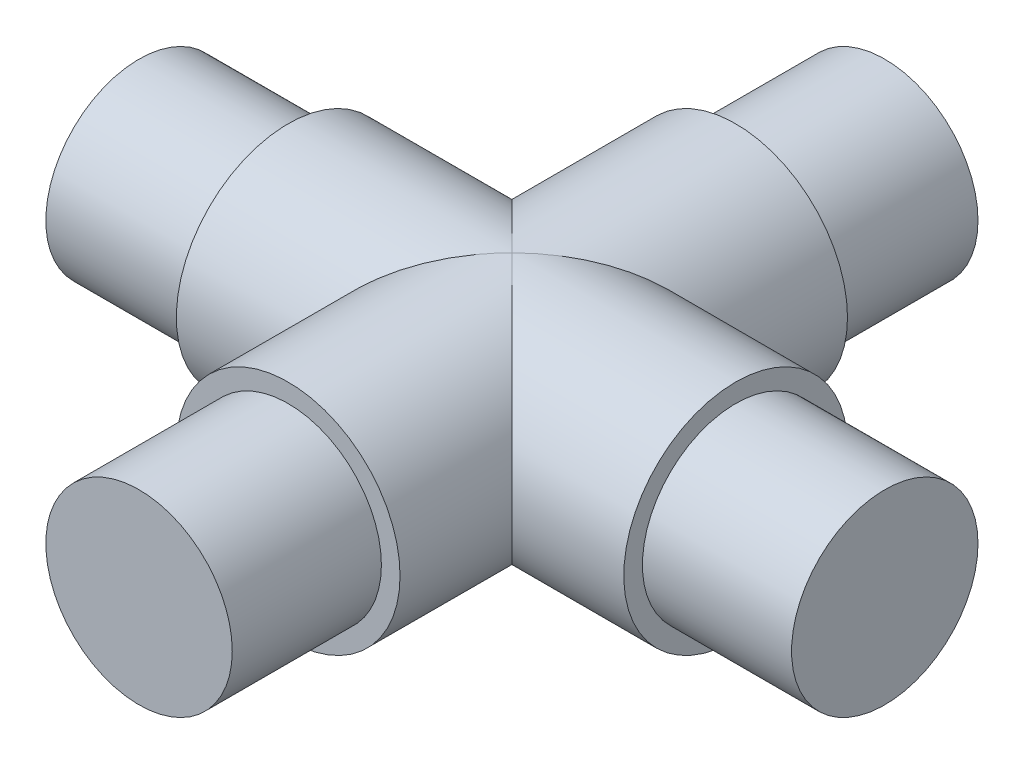
ISO-10303-21;
HEADER;
FILE_DESCRIPTION(('STEP AP214'),'2;1');
FILE_NAME('part.step','',(''),(''),'','','');
FILE_SCHEMA(('AUTOMOTIVE_DESIGN { 1 0 10303 214 1 1 1 1 }'));
ENDSEC;
DATA;
#1=APPLICATION_CONTEXT('core data for automotive mechanical design processes');
#2=APPLICATION_PROTOCOL_DEFINITION('international standard','automotive_design',2000,#1);
#3=PRODUCT_CONTEXT('',#1,'mechanical');
#4=PRODUCT('Part','Part','',(#3));
#5=PRODUCT_RELATED_PRODUCT_CATEGORY('part','',(#4));
#6=PRODUCT_DEFINITION_FORMATION('','',#4);
#7=PRODUCT_DEFINITION_CONTEXT('part definition',#1,'design');
#8=PRODUCT_DEFINITION('design','',#6,#7);
#9=PRODUCT_DEFINITION_SHAPE('','',#8);
#10=(LENGTH_UNIT() NAMED_UNIT(*) SI_UNIT(.MILLI.,.METRE.));
#11=(NAMED_UNIT(*) PLANE_ANGLE_UNIT() SI_UNIT($,.RADIAN.));
#12=(NAMED_UNIT(*) SI_UNIT($,.STERADIAN.) SOLID_ANGLE_UNIT());
#13=UNCERTAINTY_MEASURE_WITH_UNIT(LENGTH_MEASURE(1.E-05),#10,'distance_accuracy_value','');
#14=(GEOMETRIC_REPRESENTATION_CONTEXT(3) GLOBAL_UNCERTAINTY_ASSIGNED_CONTEXT((#13)) GLOBAL_UNIT_ASSIGNED_CONTEXT((#10,
#11,#12)) REPRESENTATION_CONTEXT('',''));
#15=CARTESIAN_POINT('',(0.,0.,0.));
#16=DIRECTION('',(0.,0.,1.));
#17=DIRECTION('',(1.,0.,0.));
#18=AXIS2_PLACEMENT_3D('',#15,#16,#17);
#19=CARTESIAN_POINT('',(0.,0.,100.));
#20=DIRECTION('',(0.,0.,-1.));
#21=DIRECTION('',(-1.,0.,0.));
#22=AXIS2_PLACEMENT_3D('',#19,#20,#21);
#23=CYLINDRICAL_SURFACE('',#22,30.);
#24=CARTESIAN_POINT('',(0.,0.,60.));
#25=DIRECTION('',(0.,0.,1.));
#26=DIRECTION('',(1.,0.,0.));
#27=AXIS2_PLACEMENT_3D('',#24,#25,#26);
#28=CIRCLE('',#27,30.);
#29=CARTESIAN_POINT('',(30.,0.,60.));
#30=VERTEX_POINT('',#29);
#31=EDGE_CURVE('E59',#30,#30,#28,.T.);
#32=ORIENTED_EDGE('',*,*,#31,.F.);
#33=EDGE_LOOP('',(#32));
#34=FACE_BOUND('',#33,.T.);
#35=CARTESIAN_POINT('',(0.,0.,0.));
#36=DIRECTION('',(-0.707106781186549,0.,-0.707106781186546));
#37=DIRECTION('',(0.707106781186546,0.,-0.707106781186549));
#38=AXIS2_PLACEMENT_3D('',#35,#36,#37);
#39=ELLIPSE('',#38,42.4264068711929,30.);
#40=CARTESIAN_POINT('',(0.,-30.,0.));
#41=VERTEX_POINT('',#40);
#42=CARTESIAN_POINT('',(0.,30.,0.));
#43=VERTEX_POINT('',#42);
#44=EDGE_CURVE('E43',#41,#43,#39,.T.);
#45=ORIENTED_EDGE('',*,*,#44,.F.);
#46=CARTESIAN_POINT('',(0.,0.,0.));
#47=DIRECTION('',(0.707106781186546,0.,-0.707106781186549));
#48=DIRECTION('',(-0.707106781186549,0.,-0.707106781186546));
#49=AXIS2_PLACEMENT_3D('',#46,#47,#48);
#50=ELLIPSE('',#49,42.4264068711928,30.);
#51=EDGE_CURVE('E55',#43,#41,#50,.T.);
#52=ORIENTED_EDGE('',*,*,#51,.F.);
#53=EDGE_LOOP('',(#45,#52));
#54=FACE_BOUND('',#53,.T.);
#55=ADVANCED_FACE('F35',(#34,#54),#23,.T.);
#56=CARTESIAN_POINT('',(0.,0.,60.));
#57=DIRECTION('',(0.,0.,1.));
#58=DIRECTION('',(1.,0.,0.));
#59=AXIS2_PLACEMENT_3D('',#56,#57,#58);
#60=PLANE('',#59);
#61=CARTESIAN_POINT('',(0.,0.,60.));
#62=DIRECTION('',(0.,0.,1.));
#63=DIRECTION('',(1.,0.,0.));
#64=AXIS2_PLACEMENT_3D('',#61,#62,#63);
#65=CIRCLE('',#64,25.);
#66=CARTESIAN_POINT('',(25.,0.,60.));
#67=VERTEX_POINT('',#66);
#68=EDGE_CURVE('E95',#67,#67,#65,.T.);
#69=ORIENTED_EDGE('',*,*,#68,.F.);
#70=EDGE_LOOP('',(#69));
#71=FACE_BOUND('',#70,.T.);
#72=ORIENTED_EDGE('',*,*,#31,.T.);
#73=EDGE_LOOP('',(#72));
#74=FACE_BOUND('',#73,.T.);
#75=ADVANCED_FACE('F84',(#71,#74),#60,.T.);
#76=CARTESIAN_POINT('',(0.,0.,60.));
#77=DIRECTION('',(0.,0.,1.));
#78=DIRECTION('',(1.,0.,0.));
#79=AXIS2_PLACEMENT_3D('',#76,#77,#78);
#80=CYLINDRICAL_SURFACE('',#79,25.);
#81=ORIENTED_EDGE('',*,*,#68,.T.);
#82=EDGE_LOOP('',(#81));
#83=FACE_BOUND('',#82,.T.);
#84=CARTESIAN_POINT('',(0.,0.,100.));
#85=DIRECTION('',(0.,0.,1.));
#86=DIRECTION('',(1.,0.,0.));
#87=AXIS2_PLACEMENT_3D('',#84,#85,#86);
#88=CIRCLE('',#87,25.);
#89=CARTESIAN_POINT('',(25.,0.,100.));
#90=VERTEX_POINT('',#89);
#91=EDGE_CURVE('E98',#90,#90,#88,.T.);
#92=ORIENTED_EDGE('',*,*,#91,.F.);
#93=EDGE_LOOP('',(#92));
#94=FACE_BOUND('',#93,.T.);
#95=ADVANCED_FACE('F89',(#83,#94),#80,.T.);
#96=CARTESIAN_POINT('',(0.,0.,100.));
#97=DIRECTION('',(0.,0.,1.));
#98=DIRECTION('',(1.,0.,0.));
#99=AXIS2_PLACEMENT_3D('',#96,#97,#98);
#100=PLANE('',#99);
#101=ORIENTED_EDGE('',*,*,#91,.T.);
#102=EDGE_LOOP('',(#101));
#103=FACE_BOUND('',#102,.T.);
#104=ADVANCED_FACE('F140',(#103),#100,.T.);
#105=CARTESIAN_POINT('',(-100.,0.,3.49148133884313E-13));
#106=DIRECTION('',(1.,0.,0.));
#107=DIRECTION('',(0.,0.,-1.));
#108=AXIS2_PLACEMENT_3D('',#105,#106,#107);
#109=PLANE('',#108);
#110=CARTESIAN_POINT('',(-100.,0.,3.49148133884313E-13));
#111=DIRECTION('',(1.,0.,0.));
#112=DIRECTION('',(0.,0.,-1.));
#113=AXIS2_PLACEMENT_3D('',#110,#111,#112);
#114=CIRCLE('',#113,25.);
#115=CARTESIAN_POINT('',(-100.,0.,-24.9999999999996));
#116=VERTEX_POINT('',#115);
#117=EDGE_CURVE('E125',#116,#116,#114,.T.);
#118=ORIENTED_EDGE('',*,*,#117,.F.);
#119=EDGE_LOOP('',(#118));
#120=FACE_BOUND('',#119,.T.);
#121=ADVANCED_FACE('F135',(#120),#109,.F.);
#122=CARTESIAN_POINT('',(-60.,0.,2.09488880330588E-13));
#123=DIRECTION('',(-1.,0.,0.));
#124=DIRECTION('',(0.,0.,1.));
#125=AXIS2_PLACEMENT_3D('',#122,#123,#124);
#126=CYLINDRICAL_SURFACE('',#125,25.);
#127=CARTESIAN_POINT('',(-60.,0.,2.09488880330588E-13));
#128=DIRECTION('',(1.,0.,0.));
#129=DIRECTION('',(0.,0.,-1.));
#130=AXIS2_PLACEMENT_3D('',#127,#128,#129);
#131=CIRCLE('',#130,25.);
#132=CARTESIAN_POINT('',(-60.0000000000001,0.,-24.9999999999998));
#133=VERTEX_POINT('',#132);
#134=EDGE_CURVE('E124',#133,#133,#131,.T.);
#135=ORIENTED_EDGE('',*,*,#134,.F.);
#136=EDGE_LOOP('',(#135));
#137=FACE_BOUND('',#136,.T.);
#138=ORIENTED_EDGE('',*,*,#117,.T.);
#139=EDGE_LOOP('',(#138));
#140=FACE_BOUND('',#139,.T.);
#141=ADVANCED_FACE('F132',(#137,#140),#126,.T.);
#142=CARTESIAN_POINT('',(-60.,0.,2.09488880330588E-13));
#143=DIRECTION('',(-1.,0.,0.));
#144=DIRECTION('',(0.,0.,-1.));
#145=AXIS2_PLACEMENT_3D('',#142,#143,#144);
#146=PLANE('',#145);
#147=CARTESIAN_POINT('',(-60.,0.,2.09488880330588E-13));
#148=DIRECTION('',(1.,0.,0.));
#149=DIRECTION('',(0.,0.,-1.));
#150=AXIS2_PLACEMENT_3D('',#147,#148,#149);
#151=CIRCLE('',#150,30.);
#152=CARTESIAN_POINT('',(-60.0000000000001,0.,-29.9999999999998));
#153=VERTEX_POINT('',#152);
#154=EDGE_CURVE('E119',#153,#153,#151,.T.);
#155=ORIENTED_EDGE('',*,*,#154,.F.);
#156=EDGE_LOOP('',(#155));
#157=FACE_BOUND('',#156,.T.);
#158=ORIENTED_EDGE('',*,*,#134,.T.);
#159=EDGE_LOOP('',(#158));
#160=FACE_BOUND('',#159,.T.);
#161=ADVANCED_FACE('F81',(#157,#160),#146,.T.);
#162=CARTESIAN_POINT('',(100.,0.,-3.49148133884313E-13));
#163=DIRECTION('',(-1.,0.,0.));
#164=DIRECTION('',(0.,0.,1.));
#165=AXIS2_PLACEMENT_3D('',#162,#163,#164);
#166=CYLINDRICAL_SURFACE('',#165,30.);
#167=ORIENTED_EDGE('',*,*,#154,.T.);
#168=EDGE_LOOP('',(#167));
#169=FACE_BOUND('',#168,.T.);
#170=CARTESIAN_POINT('',(0.,0.,0.));
#171=DIRECTION('',(0.707106781186546,0.,-0.707106781186549));
#172=DIRECTION('',(-0.707106781186549,0.,-0.707106781186546));
#173=AXIS2_PLACEMENT_3D('',#170,#171,#172);
#174=ELLIPSE('',#173,42.4264068711928,30.);
#175=EDGE_CURVE('E49',#43,#41,#174,.F.);
#176=ORIENTED_EDGE('',*,*,#175,.T.);
#177=ORIENTED_EDGE('',*,*,#44,.T.);
#178=EDGE_LOOP('',(#176,#177));
#179=FACE_BOUND('',#178,.T.);
#180=ADVANCED_FACE('F61',(#169,#179),#166,.T.);
#181=CARTESIAN_POINT('',(0.,0.,-100.));
#182=DIRECTION('',(0.,0.,1.));
#183=DIRECTION('',(1.,0.,0.));
#184=AXIS2_PLACEMENT_3D('',#181,#182,#183);
#185=PLANE('',#184);
#186=CARTESIAN_POINT('',(0.,0.,-100.));
#187=DIRECTION('',(0.,0.,1.));
#188=DIRECTION('',(1.,0.,0.));
#189=AXIS2_PLACEMENT_3D('',#186,#187,#188);
#190=CIRCLE('',#189,25.);
#191=CARTESIAN_POINT('',(25.,0.,-100.));
#192=VERTEX_POINT('',#191);
#193=EDGE_CURVE('E107',#192,#192,#190,.T.);
#194=ORIENTED_EDGE('',*,*,#193,.F.);
#195=EDGE_LOOP('',(#194));
#196=FACE_BOUND('',#195,.T.);
#197=ADVANCED_FACE('F80',(#196),#185,.F.);
#198=CARTESIAN_POINT('',(0.,0.,-60.));
#199=DIRECTION('',(0.,0.,-1.));
#200=DIRECTION('',(-1.,0.,0.));
#201=AXIS2_PLACEMENT_3D('',#198,#199,#200);
#202=CYLINDRICAL_SURFACE('',#201,25.);
#203=CARTESIAN_POINT('',(0.,0.,-60.));
#204=DIRECTION('',(0.,0.,1.));
#205=DIRECTION('',(1.,0.,0.));
#206=AXIS2_PLACEMENT_3D('',#203,#204,#205);
#207=CIRCLE('',#206,25.);
#208=CARTESIAN_POINT('',(25.,0.,-60.));
#209=VERTEX_POINT('',#208);
#210=EDGE_CURVE('E106',#209,#209,#207,.T.);
#211=ORIENTED_EDGE('',*,*,#210,.F.);
#212=EDGE_LOOP('',(#211));
#213=FACE_BOUND('',#212,.T.);
#214=ORIENTED_EDGE('',*,*,#193,.T.);
#215=EDGE_LOOP('',(#214));
#216=FACE_BOUND('',#215,.T.);
#217=ADVANCED_FACE('F170',(#213,#216),#202,.T.);
#218=CARTESIAN_POINT('',(0.,0.,-60.));
#219=DIRECTION('',(0.,0.,-1.));
#220=DIRECTION('',(1.,0.,0.));
#221=AXIS2_PLACEMENT_3D('',#218,#219,#220);
#222=PLANE('',#221);
#223=CARTESIAN_POINT('',(0.,0.,-60.));
#224=DIRECTION('',(0.,0.,1.));
#225=DIRECTION('',(1.,0.,0.));
#226=AXIS2_PLACEMENT_3D('',#223,#224,#225);
#227=CIRCLE('',#226,30.);
#228=CARTESIAN_POINT('',(30.,0.,-60.));
#229=VERTEX_POINT('',#228);
#230=EDGE_CURVE('E102',#229,#229,#227,.T.);
#231=ORIENTED_EDGE('',*,*,#230,.F.);
#232=EDGE_LOOP('',(#231));
#233=FACE_BOUND('',#232,.T.);
#234=ORIENTED_EDGE('',*,*,#210,.T.);
#235=EDGE_LOOP('',(#234));
#236=FACE_BOUND('',#235,.T.);
#237=ADVANCED_FACE('F74',(#233,#236),#222,.T.);
#238=ORIENTED_EDGE('',*,*,#230,.T.);
#239=EDGE_LOOP('',(#238));
#240=FACE_BOUND('',#239,.T.);
#241=CARTESIAN_POINT('',(0.,0.,0.));
#242=DIRECTION('',(-0.707106781186549,0.,-0.707106781186546));
#243=DIRECTION('',(0.707106781186546,0.,-0.707106781186549));
#244=AXIS2_PLACEMENT_3D('',#241,#242,#243);
#245=ELLIPSE('',#244,42.4264068711929,30.);
#246=EDGE_CURVE('E11',#41,#43,#245,.F.);
#247=ORIENTED_EDGE('',*,*,#246,.F.);
#248=ORIENTED_EDGE('',*,*,#175,.F.);
#249=EDGE_LOOP('',(#247,#248));
#250=FACE_BOUND('',#249,.T.);
#251=ADVANCED_FACE('F37',(#240,#250),#23,.T.);
#252=CARTESIAN_POINT('',(60.,0.,-2.09488880330588E-13));
#253=DIRECTION('',(1.,0.,0.));
#254=DIRECTION('',(0.,0.,-1.));
#255=AXIS2_PLACEMENT_3D('',#252,#253,#254);
#256=CIRCLE('',#255,30.);
#257=CARTESIAN_POINT('',(59.9999999999999,0.,-30.0000000000002));
#258=VERTEX_POINT('',#257);
#259=EDGE_CURVE('E110',#258,#258,#256,.T.);
#260=ORIENTED_EDGE('',*,*,#259,.F.);
#261=EDGE_LOOP('',(#260));
#262=FACE_BOUND('',#261,.T.);
#263=ORIENTED_EDGE('',*,*,#51,.T.);
#264=ORIENTED_EDGE('',*,*,#246,.T.);
#265=EDGE_LOOP('',(#263,#264));
#266=FACE_BOUND('',#265,.T.);
#267=ADVANCED_FACE('F62',(#262,#266),#166,.T.);
#268=CARTESIAN_POINT('',(60.,0.,-2.09488880330588E-13));
#269=DIRECTION('',(1.,0.,0.));
#270=DIRECTION('',(0.,0.,-1.));
#271=AXIS2_PLACEMENT_3D('',#268,#269,#270);
#272=PLANE('',#271);
#273=CARTESIAN_POINT('',(60.,0.,-2.09488880330588E-13));
#274=DIRECTION('',(1.,0.,0.));
#275=DIRECTION('',(0.,0.,-1.));
#276=AXIS2_PLACEMENT_3D('',#273,#274,#275);
#277=CIRCLE('',#276,25.);
#278=CARTESIAN_POINT('',(59.9999999999999,0.,-25.0000000000002));
#279=VERTEX_POINT('',#278);
#280=EDGE_CURVE('E115',#279,#279,#277,.T.);
#281=ORIENTED_EDGE('',*,*,#280,.F.);
#282=EDGE_LOOP('',(#281));
#283=FACE_BOUND('',#282,.T.);
#284=ORIENTED_EDGE('',*,*,#259,.T.);
#285=EDGE_LOOP('',(#284));
#286=FACE_BOUND('',#285,.T.);
#287=ADVANCED_FACE('F64',(#283,#286),#272,.T.);
#288=CARTESIAN_POINT('',(60.,0.,-2.09488880330588E-13));
#289=DIRECTION('',(1.,0.,0.));
#290=DIRECTION('',(0.,0.,-1.));
#291=AXIS2_PLACEMENT_3D('',#288,#289,#290);
#292=CYLINDRICAL_SURFACE('',#291,25.);
#293=ORIENTED_EDGE('',*,*,#280,.T.);
#294=EDGE_LOOP('',(#293));
#295=FACE_BOUND('',#294,.T.);
#296=CARTESIAN_POINT('',(100.,0.,-3.49148133884313E-13));
#297=DIRECTION('',(1.,0.,0.));
#298=DIRECTION('',(0.,0.,-1.));
#299=AXIS2_PLACEMENT_3D('',#296,#297,#298);
#300=CIRCLE('',#299,25.);
#301=CARTESIAN_POINT('',(99.9999999999999,0.,-25.0000000000003));
#302=VERTEX_POINT('',#301);
#303=EDGE_CURVE('E116',#302,#302,#300,.T.);
#304=ORIENTED_EDGE('',*,*,#303,.F.);
#305=EDGE_LOOP('',(#304));
#306=FACE_BOUND('',#305,.T.);
#307=ADVANCED_FACE('F71',(#295,#306),#292,.T.);
#308=CARTESIAN_POINT('',(100.,0.,-3.49148133884313E-13));
#309=DIRECTION('',(1.,0.,0.));
#310=DIRECTION('',(0.,0.,-1.));
#311=AXIS2_PLACEMENT_3D('',#308,#309,#310);
#312=PLANE('',#311);
#313=ORIENTED_EDGE('',*,*,#303,.T.);
#314=EDGE_LOOP('',(#313));
#315=FACE_BOUND('',#314,.T.);
#316=ADVANCED_FACE('F147',(#315),#312,.T.);
#317=CLOSED_SHELL('',(#55,#75,#95,#104,#121,#141,#161,#180,#197,#217,#237,#251,#267,#287,#307,#316));
#318=MANIFOLD_SOLID_BREP('B2',#317);
#319=ADVANCED_BREP_SHAPE_REPRESENTATION('',(#18,#318),#14);
#320=SHAPE_DEFINITION_REPRESENTATION(#9,#319);
ENDSEC;
END-ISO-10303-21;
